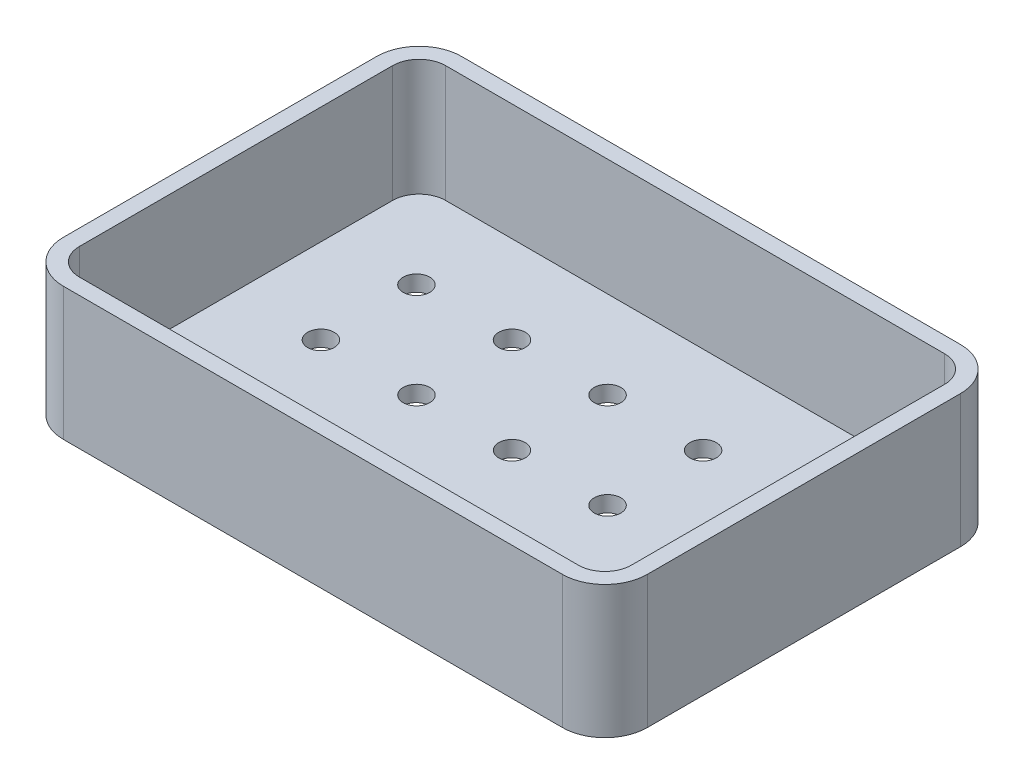
ISO-10303-21;
HEADER;
FILE_DESCRIPTION(('STEP AP214'),'2;1');
FILE_NAME('part.step','',(''),(''),'','','');
FILE_SCHEMA(('AUTOMOTIVE_DESIGN { 1 0 10303 214 1 1 1 1 }'));
ENDSEC;
DATA;
#1=APPLICATION_CONTEXT('core data for automotive mechanical design processes');
#2=APPLICATION_PROTOCOL_DEFINITION('international standard','automotive_design',2000,#1);
#3=PRODUCT_CONTEXT('',#1,'mechanical');
#4=PRODUCT('Part','Part','',(#3));
#5=PRODUCT_RELATED_PRODUCT_CATEGORY('part','',(#4));
#6=PRODUCT_DEFINITION_FORMATION('','',#4);
#7=PRODUCT_DEFINITION_CONTEXT('part definition',#1,'design');
#8=PRODUCT_DEFINITION('design','',#6,#7);
#9=PRODUCT_DEFINITION_SHAPE('','',#8);
#10=(LENGTH_UNIT() NAMED_UNIT(*) SI_UNIT(.MILLI.,.METRE.));
#11=(NAMED_UNIT(*) PLANE_ANGLE_UNIT() SI_UNIT($,.RADIAN.));
#12=(NAMED_UNIT(*) SI_UNIT($,.STERADIAN.) SOLID_ANGLE_UNIT());
#13=UNCERTAINTY_MEASURE_WITH_UNIT(LENGTH_MEASURE(1.E-05),#10,'distance_accuracy_value','');
#14=(GEOMETRIC_REPRESENTATION_CONTEXT(3) GLOBAL_UNCERTAINTY_ASSIGNED_CONTEXT((#13)) GLOBAL_UNIT_ASSIGNED_CONTEXT((#10,
#11,#12)) REPRESENTATION_CONTEXT('',''));
#15=CARTESIAN_POINT('',(0.,0.,0.));
#16=DIRECTION('',(0.,0.,1.));
#17=DIRECTION('',(1.,0.,0.));
#18=AXIS2_PLACEMENT_3D('',#15,#16,#17);
#19=CARTESIAN_POINT('',(-47.,0.,-29.5));
#20=DIRECTION('',(0.,-1.,0.));
#21=DIRECTION('',(0.,0.,-1.));
#22=AXIS2_PLACEMENT_3D('',#19,#20,#21);
#23=PLANE('',#22);
#24=CARTESIAN_POINT('',(-47.,0.,-29.5));
#25=DIRECTION('',(0.,1.,0.));
#26=DIRECTION('',(0.,0.,-1.));
#27=AXIS2_PLACEMENT_3D('',#24,#25,#26);
#28=CIRCLE('',#27,7.99999999999999);
#29=CARTESIAN_POINT('',(-47.,0.,-37.5));
#30=VERTEX_POINT('',#29);
#31=CARTESIAN_POINT('',(-55.,0.,-29.5));
#32=VERTEX_POINT('',#31);
#33=EDGE_CURVE('E165',#30,#32,#28,.T.);
#34=ORIENTED_EDGE('',*,*,#33,.T.);
#35=DIRECTION('',(0.,0.,1.));
#36=VECTOR('',#35,1.);
#37=CARTESIAN_POINT('',(-55.,0.,29.5));
#38=LINE('',#37,#36);
#39=CARTESIAN_POINT('',(-55.,0.,29.5));
#40=VERTEX_POINT('',#39);
#41=EDGE_CURVE('E169',#32,#40,#38,.T.);
#42=ORIENTED_EDGE('',*,*,#41,.T.);
#43=CARTESIAN_POINT('',(-47.,0.,29.5));
#44=DIRECTION('',(0.,1.,0.));
#45=DIRECTION('',(0.,0.,-1.));
#46=AXIS2_PLACEMENT_3D('',#43,#44,#45);
#47=CIRCLE('',#46,7.99999999999999);
#48=CARTESIAN_POINT('',(-47.,0.,37.5));
#49=VERTEX_POINT('',#48);
#50=EDGE_CURVE('E174',#40,#49,#47,.T.);
#51=ORIENTED_EDGE('',*,*,#50,.T.);
#52=DIRECTION('',(1.,0.,0.));
#53=VECTOR('',#52,1.);
#54=CARTESIAN_POINT('',(47.,0.,37.5));
#55=LINE('',#54,#53);
#56=CARTESIAN_POINT('',(47.,0.,37.5));
#57=VERTEX_POINT('',#56);
#58=EDGE_CURVE('E178',#49,#57,#55,.T.);
#59=ORIENTED_EDGE('',*,*,#58,.T.);
#60=CARTESIAN_POINT('',(47.,0.,29.5));
#61=DIRECTION('',(0.,1.,0.));
#62=DIRECTION('',(0.,0.,-1.));
#63=AXIS2_PLACEMENT_3D('',#60,#61,#62);
#64=CIRCLE('',#63,7.99999999999999);
#65=CARTESIAN_POINT('',(55.,0.,29.5));
#66=VERTEX_POINT('',#65);
#67=EDGE_CURVE('E182',#57,#66,#64,.T.);
#68=ORIENTED_EDGE('',*,*,#67,.T.);
#69=DIRECTION('',(0.,0.,-1.));
#70=VECTOR('',#69,1.);
#71=CARTESIAN_POINT('',(55.,0.,-29.5));
#72=LINE('',#71,#70);
#73=CARTESIAN_POINT('',(55.,0.,-29.5));
#74=VERTEX_POINT('',#73);
#75=EDGE_CURVE('E186',#66,#74,#72,.T.);
#76=ORIENTED_EDGE('',*,*,#75,.T.);
#77=CARTESIAN_POINT('',(47.,0.,-29.5));
#78=DIRECTION('',(0.,1.,0.));
#79=DIRECTION('',(0.,0.,-1.));
#80=AXIS2_PLACEMENT_3D('',#77,#78,#79);
#81=CIRCLE('',#80,7.99999999999999);
#82=CARTESIAN_POINT('',(47.,0.,-37.5));
#83=VERTEX_POINT('',#82);
#84=EDGE_CURVE('E135',#74,#83,#81,.T.);
#85=ORIENTED_EDGE('',*,*,#84,.T.);
#86=DIRECTION('',(-1.,0.,0.));
#87=VECTOR('',#86,1.);
#88=CARTESIAN_POINT('',(-47.,0.,-37.5));
#89=LINE('',#88,#87);
#90=EDGE_CURVE('E191',#83,#30,#89,.T.);
#91=ORIENTED_EDGE('',*,*,#90,.T.);
#92=EDGE_LOOP('',(#34,#42,#51,#59,#68,#76,#85,#91));
#93=FACE_BOUND('',#92,.T.);
#94=CARTESIAN_POINT('',(-47.,0.,-29.5));
#95=DIRECTION('',(0.,1.,0.));
#96=DIRECTION('',(0.,0.,-1.));
#97=AXIS2_PLACEMENT_3D('',#94,#95,#96);
#98=CIRCLE('',#97,5.);
#99=CARTESIAN_POINT('',(-47.,0.,-34.5));
#100=VERTEX_POINT('',#99);
#101=CARTESIAN_POINT('',(-52.,0.,-29.5));
#102=VERTEX_POINT('',#101);
#103=EDGE_CURVE('E313',#100,#102,#98,.T.);
#104=ORIENTED_EDGE('',*,*,#103,.F.);
#105=DIRECTION('',(-1.,0.,0.));
#106=VECTOR('',#105,1.);
#107=CARTESIAN_POINT('',(-47.,0.,-34.5));
#108=LINE('',#107,#106);
#109=CARTESIAN_POINT('',(47.,0.,-34.5));
#110=VERTEX_POINT('',#109);
#111=EDGE_CURVE('E290',#110,#100,#108,.T.);
#112=ORIENTED_EDGE('',*,*,#111,.F.);
#113=CARTESIAN_POINT('',(47.,0.,-29.5));
#114=DIRECTION('',(0.,1.,0.));
#115=DIRECTION('',(0.,0.,-1.));
#116=AXIS2_PLACEMENT_3D('',#113,#114,#115);
#117=CIRCLE('',#116,5.);
#118=CARTESIAN_POINT('',(52.,0.,-29.5));
#119=VERTEX_POINT('',#118);
#120=EDGE_CURVE('E572',#119,#110,#117,.T.);
#121=ORIENTED_EDGE('',*,*,#120,.F.);
#122=DIRECTION('',(0.,0.,-1.));
#123=VECTOR('',#122,1.);
#124=CARTESIAN_POINT('',(52.,0.,-29.5));
#125=LINE('',#124,#123);
#126=CARTESIAN_POINT('',(52.,0.,29.5));
#127=VERTEX_POINT('',#126);
#128=EDGE_CURVE('E570',#127,#119,#125,.T.);
#129=ORIENTED_EDGE('',*,*,#128,.F.);
#130=CARTESIAN_POINT('',(47.,0.,29.5));
#131=DIRECTION('',(0.,1.,0.));
#132=DIRECTION('',(0.,0.,-1.));
#133=AXIS2_PLACEMENT_3D('',#130,#131,#132);
#134=CIRCLE('',#133,5.);
#135=CARTESIAN_POINT('',(47.,0.,34.5));
#136=VERTEX_POINT('',#135);
#137=EDGE_CURVE('E566',#136,#127,#134,.T.);
#138=ORIENTED_EDGE('',*,*,#137,.F.);
#139=DIRECTION('',(1.,0.,0.));
#140=VECTOR('',#139,1.);
#141=CARTESIAN_POINT('',(47.,0.,34.5));
#142=LINE('',#141,#140);
#143=CARTESIAN_POINT('',(-47.,0.,34.5));
#144=VERTEX_POINT('',#143);
#145=EDGE_CURVE('E562',#144,#136,#142,.T.);
#146=ORIENTED_EDGE('',*,*,#145,.F.);
#147=CARTESIAN_POINT('',(-47.,0.,29.5));
#148=DIRECTION('',(0.,1.,0.));
#149=DIRECTION('',(0.,0.,-1.));
#150=AXIS2_PLACEMENT_3D('',#147,#148,#149);
#151=CIRCLE('',#150,5.);
#152=CARTESIAN_POINT('',(-52.,0.,29.5));
#153=VERTEX_POINT('',#152);
#154=EDGE_CURVE('E558',#153,#144,#151,.T.);
#155=ORIENTED_EDGE('',*,*,#154,.F.);
#156=DIRECTION('',(0.,0.,1.));
#157=VECTOR('',#156,1.);
#158=CARTESIAN_POINT('',(-52.,0.,29.5));
#159=LINE('',#158,#157);
#160=EDGE_CURVE('E554',#102,#153,#159,.T.);
#161=ORIENTED_EDGE('',*,*,#160,.F.);
#162=EDGE_LOOP('',(#104,#112,#121,#129,#138,#146,#155,#161));
#163=FACE_BOUND('',#162,.T.);
#164=ADVANCED_FACE('F45',(#93,#163),#23,.F.);
#165=CARTESIAN_POINT('',(-47.,-25.,-29.5));
#166=DIRECTION('',(0.,1.,0.));
#167=DIRECTION('',(0.,0.,1.));
#168=AXIS2_PLACEMENT_3D('',#165,#166,#167);
#169=CYLINDRICAL_SURFACE('',#168,7.99999999999999);
#170=ORIENTED_EDGE('',*,*,#33,.F.);
#171=DIRECTION('',(0.,1.,0.));
#172=VECTOR('',#171,1.);
#173=CARTESIAN_POINT('',(-47.,-25.,-37.5));
#174=LINE('',#173,#172);
#175=CARTESIAN_POINT('',(-47.,-25.,-37.5));
#176=VERTEX_POINT('',#175);
#177=EDGE_CURVE('E11',#176,#30,#174,.T.);
#178=ORIENTED_EDGE('',*,*,#177,.F.);
#179=CARTESIAN_POINT('',(-47.,-25.,-29.5));
#180=DIRECTION('',(0.,1.,0.));
#181=DIRECTION('',(0.,0.,-1.));
#182=AXIS2_PLACEMENT_3D('',#179,#180,#181);
#183=CIRCLE('',#182,7.99999999999999);
#184=CARTESIAN_POINT('',(-55.,-25.,-29.5));
#185=VERTEX_POINT('',#184);
#186=EDGE_CURVE('E194',#176,#185,#183,.T.);
#187=ORIENTED_EDGE('',*,*,#186,.T.);
#188=DIRECTION('',(0.,1.,0.));
#189=VECTOR('',#188,1.);
#190=CARTESIAN_POINT('',(-55.,-25.,-29.5));
#191=LINE('',#190,#189);
#192=EDGE_CURVE('E109',#185,#32,#191,.T.);
#193=ORIENTED_EDGE('',*,*,#192,.T.);
#194=EDGE_LOOP('',(#170,#178,#187,#193));
#195=FACE_BOUND('',#194,.T.);
#196=ADVANCED_FACE('F47',(#195),#169,.T.);
#197=CARTESIAN_POINT('',(-47.,-25.,-37.5));
#198=DIRECTION('',(0.,0.,-1.));
#199=DIRECTION('',(-1.,0.,0.));
#200=AXIS2_PLACEMENT_3D('',#197,#198,#199);
#201=PLANE('',#200);
#202=ORIENTED_EDGE('',*,*,#90,.F.);
#203=DIRECTION('',(0.,1.,0.));
#204=VECTOR('',#203,1.);
#205=CARTESIAN_POINT('',(47.,-25.,-37.5));
#206=LINE('',#205,#204);
#207=CARTESIAN_POINT('',(47.,-25.,-37.5));
#208=VERTEX_POINT('',#207);
#209=EDGE_CURVE('E55',#208,#83,#206,.T.);
#210=ORIENTED_EDGE('',*,*,#209,.F.);
#211=DIRECTION('',(-1.,0.,0.));
#212=VECTOR('',#211,1.);
#213=CARTESIAN_POINT('',(-47.,-25.,-37.5));
#214=LINE('',#213,#212);
#215=EDGE_CURVE('E149',#208,#176,#214,.T.);
#216=ORIENTED_EDGE('',*,*,#215,.T.);
#217=ORIENTED_EDGE('',*,*,#177,.T.);
#218=EDGE_LOOP('',(#202,#210,#216,#217));
#219=FACE_BOUND('',#218,.T.);
#220=ADVANCED_FACE('F365',(#219),#201,.T.);
#221=CARTESIAN_POINT('',(47.,-25.,-29.5));
#222=DIRECTION('',(0.,1.,0.));
#223=DIRECTION('',(0.,0.,1.));
#224=AXIS2_PLACEMENT_3D('',#221,#222,#223);
#225=CYLINDRICAL_SURFACE('',#224,7.99999999999999);
#226=ORIENTED_EDGE('',*,*,#84,.F.);
#227=DIRECTION('',(0.,1.,0.));
#228=VECTOR('',#227,1.);
#229=CARTESIAN_POINT('',(55.,-25.,-29.5));
#230=LINE('',#229,#228);
#231=CARTESIAN_POINT('',(55.,-25.,-29.5));
#232=VERTEX_POINT('',#231);
#233=EDGE_CURVE('E129',#232,#74,#230,.T.);
#234=ORIENTED_EDGE('',*,*,#233,.F.);
#235=CARTESIAN_POINT('',(47.,-25.,-29.5));
#236=DIRECTION('',(0.,1.,0.));
#237=DIRECTION('',(0.,0.,-1.));
#238=AXIS2_PLACEMENT_3D('',#235,#236,#237);
#239=CIRCLE('',#238,7.99999999999999);
#240=EDGE_CURVE('E132',#232,#208,#239,.T.);
#241=ORIENTED_EDGE('',*,*,#240,.T.);
#242=ORIENTED_EDGE('',*,*,#209,.T.);
#243=EDGE_LOOP('',(#226,#234,#241,#242));
#244=FACE_BOUND('',#243,.T.);
#245=ADVANCED_FACE('F131',(#244),#225,.T.);
#246=CARTESIAN_POINT('',(55.,-25.,-29.5));
#247=DIRECTION('',(1.,0.,0.));
#248=DIRECTION('',(0.,0.,-1.));
#249=AXIS2_PLACEMENT_3D('',#246,#247,#248);
#250=PLANE('',#249);
#251=ORIENTED_EDGE('',*,*,#75,.F.);
#252=DIRECTION('',(0.,1.,0.));
#253=VECTOR('',#252,1.);
#254=CARTESIAN_POINT('',(55.,-25.,29.5));
#255=LINE('',#254,#253);
#256=CARTESIAN_POINT('',(55.,-25.,29.5));
#257=VERTEX_POINT('',#256);
#258=EDGE_CURVE('E141',#257,#66,#255,.T.);
#259=ORIENTED_EDGE('',*,*,#258,.F.);
#260=DIRECTION('',(0.,0.,-1.));
#261=VECTOR('',#260,1.);
#262=CARTESIAN_POINT('',(55.,-25.,-29.5));
#263=LINE('',#262,#261);
#264=EDGE_CURVE('E147',#257,#232,#263,.T.);
#265=ORIENTED_EDGE('',*,*,#264,.T.);
#266=ORIENTED_EDGE('',*,*,#233,.T.);
#267=EDGE_LOOP('',(#251,#259,#265,#266));
#268=FACE_BOUND('',#267,.T.);
#269=ADVANCED_FACE('F152',(#268),#250,.T.);
#270=CARTESIAN_POINT('',(47.,-25.,29.5));
#271=DIRECTION('',(0.,1.,0.));
#272=DIRECTION('',(0.,0.,1.));
#273=AXIS2_PLACEMENT_3D('',#270,#271,#272);
#274=CYLINDRICAL_SURFACE('',#273,7.99999999999999);
#275=ORIENTED_EDGE('',*,*,#67,.F.);
#276=DIRECTION('',(0.,1.,0.));
#277=VECTOR('',#276,1.);
#278=CARTESIAN_POINT('',(47.,-25.,37.5));
#279=LINE('',#278,#277);
#280=CARTESIAN_POINT('',(47.,-25.,37.5));
#281=VERTEX_POINT('',#280);
#282=EDGE_CURVE('E200',#281,#57,#279,.T.);
#283=ORIENTED_EDGE('',*,*,#282,.F.);
#284=CARTESIAN_POINT('',(47.,-25.,29.5));
#285=DIRECTION('',(0.,1.,0.));
#286=DIRECTION('',(0.,0.,-1.));
#287=AXIS2_PLACEMENT_3D('',#284,#285,#286);
#288=CIRCLE('',#287,7.99999999999999);
#289=EDGE_CURVE('E154',#281,#257,#288,.T.);
#290=ORIENTED_EDGE('',*,*,#289,.T.);
#291=ORIENTED_EDGE('',*,*,#258,.T.);
#292=EDGE_LOOP('',(#275,#283,#290,#291));
#293=FACE_BOUND('',#292,.T.);
#294=ADVANCED_FACE('F872',(#293),#274,.T.);
#295=CARTESIAN_POINT('',(47.,-25.,37.5));
#296=DIRECTION('',(0.,0.,1.));
#297=DIRECTION('',(1.,0.,0.));
#298=AXIS2_PLACEMENT_3D('',#295,#296,#297);
#299=PLANE('',#298);
#300=ORIENTED_EDGE('',*,*,#58,.F.);
#301=DIRECTION('',(0.,1.,0.));
#302=VECTOR('',#301,1.);
#303=CARTESIAN_POINT('',(-47.,-25.,37.5));
#304=LINE('',#303,#302);
#305=CARTESIAN_POINT('',(-47.,-25.,37.5));
#306=VERTEX_POINT('',#305);
#307=EDGE_CURVE('E203',#306,#49,#304,.T.);
#308=ORIENTED_EDGE('',*,*,#307,.F.);
#309=DIRECTION('',(1.,0.,0.));
#310=VECTOR('',#309,1.);
#311=CARTESIAN_POINT('',(47.,-25.,37.5));
#312=LINE('',#311,#310);
#313=EDGE_CURVE('E159',#306,#281,#312,.T.);
#314=ORIENTED_EDGE('',*,*,#313,.T.);
#315=ORIENTED_EDGE('',*,*,#282,.T.);
#316=EDGE_LOOP('',(#300,#308,#314,#315));
#317=FACE_BOUND('',#316,.T.);
#318=ADVANCED_FACE('F356',(#317),#299,.T.);
#319=CARTESIAN_POINT('',(-47.,-25.,29.5));
#320=DIRECTION('',(0.,1.,0.));
#321=DIRECTION('',(0.,0.,1.));
#322=AXIS2_PLACEMENT_3D('',#319,#320,#321);
#323=CYLINDRICAL_SURFACE('',#322,7.99999999999999);
#324=ORIENTED_EDGE('',*,*,#50,.F.);
#325=DIRECTION('',(0.,1.,0.));
#326=VECTOR('',#325,1.);
#327=CARTESIAN_POINT('',(-55.,-25.,29.5));
#328=LINE('',#327,#326);
#329=CARTESIAN_POINT('',(-55.,-25.,29.5));
#330=VERTEX_POINT('',#329);
#331=EDGE_CURVE('E206',#330,#40,#328,.T.);
#332=ORIENTED_EDGE('',*,*,#331,.F.);
#333=CARTESIAN_POINT('',(-47.,-25.,29.5));
#334=DIRECTION('',(0.,1.,0.));
#335=DIRECTION('',(0.,0.,-1.));
#336=AXIS2_PLACEMENT_3D('',#333,#334,#335);
#337=CIRCLE('',#336,7.99999999999999);
#338=EDGE_CURVE('E347',#330,#306,#337,.T.);
#339=ORIENTED_EDGE('',*,*,#338,.T.);
#340=ORIENTED_EDGE('',*,*,#307,.T.);
#341=EDGE_LOOP('',(#324,#332,#339,#340));
#342=FACE_BOUND('',#341,.T.);
#343=ADVANCED_FACE('F361',(#342),#323,.T.);
#344=CARTESIAN_POINT('',(-55.,-25.,29.5));
#345=DIRECTION('',(-1.,0.,0.));
#346=DIRECTION('',(0.,0.,1.));
#347=AXIS2_PLACEMENT_3D('',#344,#345,#346);
#348=PLANE('',#347);
#349=ORIENTED_EDGE('',*,*,#41,.F.);
#350=ORIENTED_EDGE('',*,*,#192,.F.);
#351=DIRECTION('',(0.,0.,1.));
#352=VECTOR('',#351,1.);
#353=CARTESIAN_POINT('',(-55.,-25.,29.5));
#354=LINE('',#353,#352);
#355=EDGE_CURVE('E344',#185,#330,#354,.T.);
#356=ORIENTED_EDGE('',*,*,#355,.T.);
#357=ORIENTED_EDGE('',*,*,#331,.T.);
#358=EDGE_LOOP('',(#349,#350,#356,#357));
#359=FACE_BOUND('',#358,.T.);
#360=ADVANCED_FACE('F362',(#359),#348,.T.);
#361=CARTESIAN_POINT('',(-47.,-25.,-29.5));
#362=DIRECTION('',(0.,-1.,0.));
#363=DIRECTION('',(0.,0.,-1.));
#364=AXIS2_PLACEMENT_3D('',#361,#362,#363);
#365=PLANE('',#364);
#366=CARTESIAN_POINT('',(-18.,-25.,-18.));
#367=DIRECTION('',(0.,1.,0.));
#368=DIRECTION('',(0.,0.,1.));
#369=AXIS2_PLACEMENT_3D('',#366,#367,#368);
#370=CIRCLE('',#369,2.5);
#371=CARTESIAN_POINT('',(-18.,-25.,-15.5));
#372=VERTEX_POINT('',#371);
#373=EDGE_CURVE('E520',#372,#372,#370,.T.);
#374=ORIENTED_EDGE('',*,*,#373,.T.);
#375=EDGE_LOOP('',(#374));
#376=FACE_BOUND('',#375,.T.);
#377=CARTESIAN_POINT('',(0.,-25.,-18.));
#378=DIRECTION('',(0.,1.,0.));
#379=DIRECTION('',(0.,0.,1.));
#380=AXIS2_PLACEMENT_3D('',#377,#378,#379);
#381=CIRCLE('',#380,2.5);
#382=CARTESIAN_POINT('',(0.,-25.,-15.5));
#383=VERTEX_POINT('',#382);
#384=EDGE_CURVE('E524',#383,#383,#381,.T.);
#385=ORIENTED_EDGE('',*,*,#384,.T.);
#386=EDGE_LOOP('',(#385));
#387=FACE_BOUND('',#386,.T.);
#388=CARTESIAN_POINT('',(18.,-25.,-18.));
#389=DIRECTION('',(0.,1.,0.));
#390=DIRECTION('',(0.,0.,1.));
#391=AXIS2_PLACEMENT_3D('',#388,#389,#390);
#392=CIRCLE('',#391,2.5);
#393=CARTESIAN_POINT('',(18.,-25.,-15.5));
#394=VERTEX_POINT('',#393);
#395=EDGE_CURVE('E528',#394,#394,#392,.T.);
#396=ORIENTED_EDGE('',*,*,#395,.T.);
#397=EDGE_LOOP('',(#396));
#398=FACE_BOUND('',#397,.T.);
#399=CARTESIAN_POINT('',(36.,-25.,-18.));
#400=DIRECTION('',(0.,1.,0.));
#401=DIRECTION('',(0.,0.,1.));
#402=AXIS2_PLACEMENT_3D('',#399,#400,#401);
#403=CIRCLE('',#402,2.5);
#404=CARTESIAN_POINT('',(36.,-25.,-15.5));
#405=VERTEX_POINT('',#404);
#406=EDGE_CURVE('E532',#405,#405,#403,.T.);
#407=ORIENTED_EDGE('',*,*,#406,.T.);
#408=EDGE_LOOP('',(#407));
#409=FACE_BOUND('',#408,.T.);
#410=CARTESIAN_POINT('',(-36.,-25.,0.));
#411=DIRECTION('',(0.,1.,0.));
#412=DIRECTION('',(0.,0.,1.));
#413=AXIS2_PLACEMENT_3D('',#410,#411,#412);
#414=CIRCLE('',#413,2.5);
#415=CARTESIAN_POINT('',(-36.,-25.,2.5));
#416=VERTEX_POINT('',#415);
#417=EDGE_CURVE('E536',#416,#416,#414,.T.);
#418=ORIENTED_EDGE('',*,*,#417,.T.);
#419=EDGE_LOOP('',(#418));
#420=FACE_BOUND('',#419,.T.);
#421=CARTESIAN_POINT('',(-18.,-25.,0.));
#422=DIRECTION('',(0.,1.,0.));
#423=DIRECTION('',(0.,0.,1.));
#424=AXIS2_PLACEMENT_3D('',#421,#422,#423);
#425=CIRCLE('',#424,2.5);
#426=CARTESIAN_POINT('',(-18.,-25.,2.5));
#427=VERTEX_POINT('',#426);
#428=EDGE_CURVE('E539',#427,#427,#425,.T.);
#429=ORIENTED_EDGE('',*,*,#428,.T.);
#430=EDGE_LOOP('',(#429));
#431=FACE_BOUND('',#430,.T.);
#432=CARTESIAN_POINT('',(0.,-25.,0.));
#433=DIRECTION('',(0.,1.,0.));
#434=DIRECTION('',(0.,0.,1.));
#435=AXIS2_PLACEMENT_3D('',#432,#433,#434);
#436=CIRCLE('',#435,2.5);
#437=CARTESIAN_POINT('',(0.,-25.,2.5));
#438=VERTEX_POINT('',#437);
#439=EDGE_CURVE('E542',#438,#438,#436,.T.);
#440=ORIENTED_EDGE('',*,*,#439,.T.);
#441=EDGE_LOOP('',(#440));
#442=FACE_BOUND('',#441,.T.);
#443=CARTESIAN_POINT('',(18.,-25.,0.));
#444=DIRECTION('',(0.,1.,0.));
#445=DIRECTION('',(0.,0.,1.));
#446=AXIS2_PLACEMENT_3D('',#443,#444,#445);
#447=CIRCLE('',#446,2.5);
#448=CARTESIAN_POINT('',(18.,-25.,2.5));
#449=VERTEX_POINT('',#448);
#450=EDGE_CURVE('E516',#449,#449,#447,.T.);
#451=ORIENTED_EDGE('',*,*,#450,.T.);
#452=EDGE_LOOP('',(#451));
#453=FACE_BOUND('',#452,.T.);
#454=CARTESIAN_POINT('',(36.,-25.,18.));
#455=DIRECTION('',(0.,1.,0.));
#456=DIRECTION('',(0.,0.,1.));
#457=AXIS2_PLACEMENT_3D('',#454,#455,#456);
#458=CIRCLE('',#457,2.5);
#459=CARTESIAN_POINT('',(36.,-25.,20.5));
#460=VERTEX_POINT('',#459);
#461=EDGE_CURVE('E497',#460,#460,#458,.T.);
#462=ORIENTED_EDGE('',*,*,#461,.T.);
#463=EDGE_LOOP('',(#462));
#464=FACE_BOUND('',#463,.T.);
#465=CARTESIAN_POINT('',(18.,-25.,18.));
#466=DIRECTION('',(0.,1.,0.));
#467=DIRECTION('',(0.,0.,1.));
#468=AXIS2_PLACEMENT_3D('',#465,#466,#467);
#469=CIRCLE('',#468,2.5);
#470=CARTESIAN_POINT('',(18.,-25.,20.5));
#471=VERTEX_POINT('',#470);
#472=EDGE_CURVE('E477',#471,#471,#469,.T.);
#473=ORIENTED_EDGE('',*,*,#472,.T.);
#474=EDGE_LOOP('',(#473));
#475=FACE_BOUND('',#474,.T.);
#476=CARTESIAN_POINT('',(36.,-25.,0.));
#477=DIRECTION('',(0.,1.,0.));
#478=DIRECTION('',(0.,0.,1.));
#479=AXIS2_PLACEMENT_3D('',#476,#477,#478);
#480=CIRCLE('',#479,2.5);
#481=CARTESIAN_POINT('',(36.,-25.,2.5));
#482=VERTEX_POINT('',#481);
#483=EDGE_CURVE('E512',#482,#482,#480,.T.);
#484=ORIENTED_EDGE('',*,*,#483,.T.);
#485=EDGE_LOOP('',(#484));
#486=FACE_BOUND('',#485,.T.);
#487=CARTESIAN_POINT('',(-36.,-25.,18.));
#488=DIRECTION('',(0.,1.,0.));
#489=DIRECTION('',(0.,0.,1.));
#490=AXIS2_PLACEMENT_3D('',#487,#488,#489);
#491=CIRCLE('',#490,2.5);
#492=CARTESIAN_POINT('',(-36.,-25.,20.5));
#493=VERTEX_POINT('',#492);
#494=EDGE_CURVE('E510',#493,#493,#491,.T.);
#495=ORIENTED_EDGE('',*,*,#494,.T.);
#496=EDGE_LOOP('',(#495));
#497=FACE_BOUND('',#496,.T.);
#498=CARTESIAN_POINT('',(-18.,-25.,18.));
#499=DIRECTION('',(0.,1.,0.));
#500=DIRECTION('',(0.,0.,1.));
#501=AXIS2_PLACEMENT_3D('',#498,#499,#500);
#502=CIRCLE('',#501,2.5);
#503=CARTESIAN_POINT('',(-18.,-25.,20.5));
#504=VERTEX_POINT('',#503);
#505=EDGE_CURVE('E502',#504,#504,#502,.T.);
#506=ORIENTED_EDGE('',*,*,#505,.T.);
#507=EDGE_LOOP('',(#506));
#508=FACE_BOUND('',#507,.T.);
#509=CARTESIAN_POINT('',(0.,-25.,18.));
#510=DIRECTION('',(0.,1.,0.));
#511=DIRECTION('',(0.,0.,1.));
#512=AXIS2_PLACEMENT_3D('',#509,#510,#511);
#513=CIRCLE('',#512,2.5);
#514=CARTESIAN_POINT('',(0.,-25.,20.5));
#515=VERTEX_POINT('',#514);
#516=EDGE_CURVE('E496',#515,#515,#513,.T.);
#517=ORIENTED_EDGE('',*,*,#516,.T.);
#518=EDGE_LOOP('',(#517));
#519=FACE_BOUND('',#518,.T.);
#520=CARTESIAN_POINT('',(-36.,-25.,-18.));
#521=DIRECTION('',(0.,1.,0.));
#522=DIRECTION('',(0.,0.,1.));
#523=AXIS2_PLACEMENT_3D('',#520,#521,#522);
#524=CIRCLE('',#523,2.5);
#525=CARTESIAN_POINT('',(-36.,-25.,-15.5));
#526=VERTEX_POINT('',#525);
#527=EDGE_CURVE('E216',#526,#526,#524,.T.);
#528=ORIENTED_EDGE('',*,*,#527,.T.);
#529=EDGE_LOOP('',(#528));
#530=FACE_BOUND('',#529,.T.);
#531=ORIENTED_EDGE('',*,*,#186,.F.);
#532=ORIENTED_EDGE('',*,*,#215,.F.);
#533=ORIENTED_EDGE('',*,*,#240,.F.);
#534=ORIENTED_EDGE('',*,*,#264,.F.);
#535=ORIENTED_EDGE('',*,*,#289,.F.);
#536=ORIENTED_EDGE('',*,*,#313,.F.);
#537=ORIENTED_EDGE('',*,*,#338,.F.);
#538=ORIENTED_EDGE('',*,*,#355,.F.);
#539=EDGE_LOOP('',(#531,#532,#533,#534,#535,#536,#537,#538));
#540=FACE_BOUND('',#539,.T.);
#541=ADVANCED_FACE('F145',(#376,#387,#398,#409,#420,#431,#442,#453,#464,#475,#486,#497,#508,
#519,#530,#540),#365,.T.);
#542=CARTESIAN_POINT('',(-47.,0.,-29.5));
#543=DIRECTION('',(0.,-1.,0.));
#544=DIRECTION('',(0.,0.,-1.));
#545=AXIS2_PLACEMENT_3D('',#542,#543,#544);
#546=CYLINDRICAL_SURFACE('',#545,5.);
#547=CARTESIAN_POINT('',(-47.,-22.,-29.5));
#548=DIRECTION('',(0.,1.,0.));
#549=DIRECTION('',(0.,0.,-1.));
#550=AXIS2_PLACEMENT_3D('',#547,#548,#549);
#551=CIRCLE('',#550,5.);
#552=CARTESIAN_POINT('',(-47.,-22.,-34.5));
#553=VERTEX_POINT('',#552);
#554=CARTESIAN_POINT('',(-52.,-22.,-29.5));
#555=VERTEX_POINT('',#554);
#556=EDGE_CURVE('E271',#553,#555,#551,.T.);
#557=ORIENTED_EDGE('',*,*,#556,.F.);
#558=DIRECTION('',(0.,-1.,0.));
#559=VECTOR('',#558,1.);
#560=CARTESIAN_POINT('',(-47.,0.,-34.5));
#561=LINE('',#560,#559);
#562=EDGE_CURVE('E314',#100,#553,#561,.T.);
#563=ORIENTED_EDGE('',*,*,#562,.F.);
#564=ORIENTED_EDGE('',*,*,#103,.T.);
#565=DIRECTION('',(0.,-1.,0.));
#566=VECTOR('',#565,1.);
#567=CARTESIAN_POINT('',(-52.,0.,-29.5));
#568=LINE('',#567,#566);
#569=EDGE_CURVE('E170',#102,#555,#568,.T.);
#570=ORIENTED_EDGE('',*,*,#569,.T.);
#571=EDGE_LOOP('',(#557,#563,#564,#570));
#572=FACE_BOUND('',#571,.T.);
#573=ADVANCED_FACE('F378',(#572),#546,.F.);
#574=CARTESIAN_POINT('',(-52.,0.,29.5));
#575=DIRECTION('',(1.,0.,0.));
#576=DIRECTION('',(0.,0.,-1.));
#577=AXIS2_PLACEMENT_3D('',#574,#575,#576);
#578=PLANE('',#577);
#579=DIRECTION('',(0.,0.,1.));
#580=VECTOR('',#579,1.);
#581=CARTESIAN_POINT('',(-52.,-22.,29.5));
#582=LINE('',#581,#580);
#583=CARTESIAN_POINT('',(-52.,-22.,29.5));
#584=VERTEX_POINT('',#583);
#585=EDGE_CURVE('E277',#555,#584,#582,.T.);
#586=ORIENTED_EDGE('',*,*,#585,.F.);
#587=ORIENTED_EDGE('',*,*,#569,.F.);
#588=ORIENTED_EDGE('',*,*,#160,.T.);
#589=DIRECTION('',(0.,-1.,0.));
#590=VECTOR('',#589,1.);
#591=CARTESIAN_POINT('',(-52.,0.,29.5));
#592=LINE('',#591,#590);
#593=EDGE_CURVE('E335',#153,#584,#592,.T.);
#594=ORIENTED_EDGE('',*,*,#593,.T.);
#595=EDGE_LOOP('',(#586,#587,#588,#594));
#596=FACE_BOUND('',#595,.T.);
#597=ADVANCED_FACE('F382',(#596),#578,.T.);
#598=CARTESIAN_POINT('',(-47.,0.,29.5));
#599=DIRECTION('',(0.,-1.,0.));
#600=DIRECTION('',(0.,0.,-1.));
#601=AXIS2_PLACEMENT_3D('',#598,#599,#600);
#602=CYLINDRICAL_SURFACE('',#601,5.);
#603=CARTESIAN_POINT('',(-47.,-22.,29.5));
#604=DIRECTION('',(0.,1.,0.));
#605=DIRECTION('',(0.,0.,-1.));
#606=AXIS2_PLACEMENT_3D('',#603,#604,#605);
#607=CIRCLE('',#606,5.);
#608=CARTESIAN_POINT('',(-47.,-22.,34.5));
#609=VERTEX_POINT('',#608);
#610=EDGE_CURVE('E287',#584,#609,#607,.T.);
#611=ORIENTED_EDGE('',*,*,#610,.F.);
#612=ORIENTED_EDGE('',*,*,#593,.F.);
#613=ORIENTED_EDGE('',*,*,#154,.T.);
#614=DIRECTION('',(0.,-1.,0.));
#615=VECTOR('',#614,1.);
#616=CARTESIAN_POINT('',(-47.,0.,34.5));
#617=LINE('',#616,#615);
#618=EDGE_CURVE('E331',#144,#609,#617,.T.);
#619=ORIENTED_EDGE('',*,*,#618,.T.);
#620=EDGE_LOOP('',(#611,#612,#613,#619));
#621=FACE_BOUND('',#620,.T.);
#622=ADVANCED_FACE('F386',(#621),#602,.F.);
#623=CARTESIAN_POINT('',(47.,0.,34.5));
#624=DIRECTION('',(0.,0.,-1.));
#625=DIRECTION('',(-1.,0.,0.));
#626=AXIS2_PLACEMENT_3D('',#623,#624,#625);
#627=PLANE('',#626);
#628=DIRECTION('',(1.,0.,0.));
#629=VECTOR('',#628,1.);
#630=CARTESIAN_POINT('',(47.,-22.,34.5));
#631=LINE('',#630,#629);
#632=CARTESIAN_POINT('',(47.,-22.,34.5));
#633=VERTEX_POINT('',#632);
#634=EDGE_CURVE('E295',#609,#633,#631,.T.);
#635=ORIENTED_EDGE('',*,*,#634,.F.);
#636=ORIENTED_EDGE('',*,*,#618,.F.);
#637=ORIENTED_EDGE('',*,*,#145,.T.);
#638=DIRECTION('',(0.,-1.,0.));
#639=VECTOR('',#638,1.);
#640=CARTESIAN_POINT('',(47.,0.,34.5));
#641=LINE('',#640,#639);
#642=EDGE_CURVE('E327',#136,#633,#641,.T.);
#643=ORIENTED_EDGE('',*,*,#642,.T.);
#644=EDGE_LOOP('',(#635,#636,#637,#643));
#645=FACE_BOUND('',#644,.T.);
#646=ADVANCED_FACE('F390',(#645),#627,.T.);
#647=CARTESIAN_POINT('',(47.,0.,29.5));
#648=DIRECTION('',(0.,-1.,0.));
#649=DIRECTION('',(0.,0.,-1.));
#650=AXIS2_PLACEMENT_3D('',#647,#648,#649);
#651=CYLINDRICAL_SURFACE('',#650,5.);
#652=CARTESIAN_POINT('',(47.,-22.,29.5));
#653=DIRECTION('',(0.,1.,0.));
#654=DIRECTION('',(0.,0.,-1.));
#655=AXIS2_PLACEMENT_3D('',#652,#653,#654);
#656=CIRCLE('',#655,5.);
#657=CARTESIAN_POINT('',(52.,-22.,29.5));
#658=VERTEX_POINT('',#657);
#659=EDGE_CURVE('E299',#633,#658,#656,.T.);
#660=ORIENTED_EDGE('',*,*,#659,.F.);
#661=ORIENTED_EDGE('',*,*,#642,.F.);
#662=ORIENTED_EDGE('',*,*,#137,.T.);
#663=DIRECTION('',(0.,-1.,0.));
#664=VECTOR('',#663,1.);
#665=CARTESIAN_POINT('',(52.,0.,29.5));
#666=LINE('',#665,#664);
#667=EDGE_CURVE('E324',#127,#658,#666,.T.);
#668=ORIENTED_EDGE('',*,*,#667,.T.);
#669=EDGE_LOOP('',(#660,#661,#662,#668));
#670=FACE_BOUND('',#669,.T.);
#671=ADVANCED_FACE('F394',(#670),#651,.F.);
#672=CARTESIAN_POINT('',(52.,0.,-29.5));
#673=DIRECTION('',(-1.,0.,0.));
#674=DIRECTION('',(0.,0.,1.));
#675=AXIS2_PLACEMENT_3D('',#672,#673,#674);
#676=PLANE('',#675);
#677=DIRECTION('',(0.,0.,-1.));
#678=VECTOR('',#677,1.);
#679=CARTESIAN_POINT('',(52.,-22.,-29.5));
#680=LINE('',#679,#678);
#681=CARTESIAN_POINT('',(52.,-22.,-29.5));
#682=VERTEX_POINT('',#681);
#683=EDGE_CURVE('E303',#658,#682,#680,.T.);
#684=ORIENTED_EDGE('',*,*,#683,.F.);
#685=ORIENTED_EDGE('',*,*,#667,.F.);
#686=ORIENTED_EDGE('',*,*,#128,.T.);
#687=DIRECTION('',(0.,-1.,0.));
#688=VECTOR('',#687,1.);
#689=CARTESIAN_POINT('',(52.,0.,-29.5));
#690=LINE('',#689,#688);
#691=EDGE_CURVE('E320',#119,#682,#690,.T.);
#692=ORIENTED_EDGE('',*,*,#691,.T.);
#693=EDGE_LOOP('',(#684,#685,#686,#692));
#694=FACE_BOUND('',#693,.T.);
#695=ADVANCED_FACE('F398',(#694),#676,.T.);
#696=CARTESIAN_POINT('',(47.,0.,-29.5));
#697=DIRECTION('',(0.,-1.,0.));
#698=DIRECTION('',(0.,0.,-1.));
#699=AXIS2_PLACEMENT_3D('',#696,#697,#698);
#700=CYLINDRICAL_SURFACE('',#699,5.);
#701=CARTESIAN_POINT('',(47.,-22.,-29.5));
#702=DIRECTION('',(0.,1.,0.));
#703=DIRECTION('',(0.,0.,-1.));
#704=AXIS2_PLACEMENT_3D('',#701,#702,#703);
#705=CIRCLE('',#704,5.);
#706=CARTESIAN_POINT('',(47.,-22.,-34.5));
#707=VERTEX_POINT('',#706);
#708=EDGE_CURVE('E307',#682,#707,#705,.T.);
#709=ORIENTED_EDGE('',*,*,#708,.F.);
#710=ORIENTED_EDGE('',*,*,#691,.F.);
#711=ORIENTED_EDGE('',*,*,#120,.T.);
#712=DIRECTION('',(0.,-1.,0.));
#713=VECTOR('',#712,1.);
#714=CARTESIAN_POINT('',(47.,0.,-34.5));
#715=LINE('',#714,#713);
#716=EDGE_CURVE('E63',#110,#707,#715,.T.);
#717=ORIENTED_EDGE('',*,*,#716,.T.);
#718=EDGE_LOOP('',(#709,#710,#711,#717));
#719=FACE_BOUND('',#718,.T.);
#720=ADVANCED_FACE('F402',(#719),#700,.F.);
#721=CARTESIAN_POINT('',(-47.,0.,-34.5));
#722=DIRECTION('',(0.,0.,1.));
#723=DIRECTION('',(1.,0.,0.));
#724=AXIS2_PLACEMENT_3D('',#721,#722,#723);
#725=PLANE('',#724);
#726=DIRECTION('',(-1.,0.,0.));
#727=VECTOR('',#726,1.);
#728=CARTESIAN_POINT('',(-47.,-22.,-34.5));
#729=LINE('',#728,#727);
#730=EDGE_CURVE('E311',#707,#553,#729,.T.);
#731=ORIENTED_EDGE('',*,*,#730,.F.);
#732=ORIENTED_EDGE('',*,*,#716,.F.);
#733=ORIENTED_EDGE('',*,*,#111,.T.);
#734=ORIENTED_EDGE('',*,*,#562,.T.);
#735=EDGE_LOOP('',(#731,#732,#733,#734));
#736=FACE_BOUND('',#735,.T.);
#737=ADVANCED_FACE('F406',(#736),#725,.T.);
#738=CARTESIAN_POINT('',(-47.,-22.,-29.5));
#739=DIRECTION('',(0.,-1.,0.));
#740=DIRECTION('',(0.,0.,-1.));
#741=AXIS2_PLACEMENT_3D('',#738,#739,#740);
#742=PLANE('',#741);
#743=CARTESIAN_POINT('',(-18.,-22.,-18.));
#744=DIRECTION('',(0.,-1.,0.));
#745=DIRECTION('',(0.,0.,-1.));
#746=AXIS2_PLACEMENT_3D('',#743,#744,#745);
#747=CIRCLE('',#746,2.5);
#748=CARTESIAN_POINT('',(-18.,-22.,-20.5));
#749=VERTEX_POINT('',#748);
#750=EDGE_CURVE('E49',#749,#749,#747,.F.);
#751=ORIENTED_EDGE('',*,*,#750,.F.);
#752=EDGE_LOOP('',(#751));
#753=FACE_BOUND('',#752,.T.);
#754=CARTESIAN_POINT('',(0.,-22.,-18.));
#755=DIRECTION('',(0.,-1.,0.));
#756=DIRECTION('',(0.,0.,-1.));
#757=AXIS2_PLACEMENT_3D('',#754,#755,#756);
#758=CIRCLE('',#757,2.5);
#759=CARTESIAN_POINT('',(0.,-22.,-20.5));
#760=VERTEX_POINT('',#759);
#761=EDGE_CURVE('E263',#760,#760,#758,.F.);
#762=ORIENTED_EDGE('',*,*,#761,.F.);
#763=EDGE_LOOP('',(#762));
#764=FACE_BOUND('',#763,.T.);
#765=CARTESIAN_POINT('',(18.,-22.,-18.));
#766=DIRECTION('',(0.,-1.,0.));
#767=DIRECTION('',(0.,0.,-1.));
#768=AXIS2_PLACEMENT_3D('',#765,#766,#767);
#769=CIRCLE('',#768,2.5);
#770=CARTESIAN_POINT('',(18.,-22.,-20.5));
#771=VERTEX_POINT('',#770);
#772=EDGE_CURVE('E260',#771,#771,#769,.F.);
#773=ORIENTED_EDGE('',*,*,#772,.F.);
#774=EDGE_LOOP('',(#773));
#775=FACE_BOUND('',#774,.T.);
#776=CARTESIAN_POINT('',(36.,-22.,-18.));
#777=DIRECTION('',(0.,-1.,0.));
#778=DIRECTION('',(0.,0.,-1.));
#779=AXIS2_PLACEMENT_3D('',#776,#777,#778);
#780=CIRCLE('',#779,2.5);
#781=CARTESIAN_POINT('',(36.,-22.,-20.5));
#782=VERTEX_POINT('',#781);
#783=EDGE_CURVE('E256',#782,#782,#780,.F.);
#784=ORIENTED_EDGE('',*,*,#783,.F.);
#785=EDGE_LOOP('',(#784));
#786=FACE_BOUND('',#785,.T.);
#787=CARTESIAN_POINT('',(-36.,-22.,0.));
#788=DIRECTION('',(0.,-1.,0.));
#789=DIRECTION('',(0.,0.,-1.));
#790=AXIS2_PLACEMENT_3D('',#787,#788,#789);
#791=CIRCLE('',#790,2.5);
#792=CARTESIAN_POINT('',(-36.,-22.,-2.5));
#793=VERTEX_POINT('',#792);
#794=EDGE_CURVE('E252',#793,#793,#791,.F.);
#795=ORIENTED_EDGE('',*,*,#794,.F.);
#796=EDGE_LOOP('',(#795));
#797=FACE_BOUND('',#796,.T.);
#798=CARTESIAN_POINT('',(-18.,-22.,0.));
#799=DIRECTION('',(0.,-1.,0.));
#800=DIRECTION('',(0.,0.,-1.));
#801=AXIS2_PLACEMENT_3D('',#798,#799,#800);
#802=CIRCLE('',#801,2.5);
#803=CARTESIAN_POINT('',(-18.,-22.,-2.5));
#804=VERTEX_POINT('',#803);
#805=EDGE_CURVE('E248',#804,#804,#802,.F.);
#806=ORIENTED_EDGE('',*,*,#805,.F.);
#807=EDGE_LOOP('',(#806));
#808=FACE_BOUND('',#807,.T.);
#809=CARTESIAN_POINT('',(0.,-22.,0.));
#810=DIRECTION('',(0.,-1.,0.));
#811=DIRECTION('',(0.,0.,-1.));
#812=AXIS2_PLACEMENT_3D('',#809,#810,#811);
#813=CIRCLE('',#812,2.5);
#814=CARTESIAN_POINT('',(0.,-22.,-2.5));
#815=VERTEX_POINT('',#814);
#816=EDGE_CURVE('E244',#815,#815,#813,.F.);
#817=ORIENTED_EDGE('',*,*,#816,.F.);
#818=EDGE_LOOP('',(#817));
#819=FACE_BOUND('',#818,.T.);
#820=CARTESIAN_POINT('',(18.,-22.,0.));
#821=DIRECTION('',(0.,-1.,0.));
#822=DIRECTION('',(0.,0.,-1.));
#823=AXIS2_PLACEMENT_3D('',#820,#821,#822);
#824=CIRCLE('',#823,2.5);
#825=CARTESIAN_POINT('',(18.,-22.,-2.5));
#826=VERTEX_POINT('',#825);
#827=EDGE_CURVE('E240',#826,#826,#824,.F.);
#828=ORIENTED_EDGE('',*,*,#827,.F.);
#829=EDGE_LOOP('',(#828));
#830=FACE_BOUND('',#829,.T.);
#831=CARTESIAN_POINT('',(36.,-22.,18.));
#832=DIRECTION('',(0.,-1.,0.));
#833=DIRECTION('',(0.,0.,-1.));
#834=AXIS2_PLACEMENT_3D('',#831,#832,#833);
#835=CIRCLE('',#834,2.5);
#836=CARTESIAN_POINT('',(36.,-22.,15.5));
#837=VERTEX_POINT('',#836);
#838=EDGE_CURVE('E236',#837,#837,#835,.F.);
#839=ORIENTED_EDGE('',*,*,#838,.F.);
#840=EDGE_LOOP('',(#839));
#841=FACE_BOUND('',#840,.T.);
#842=CARTESIAN_POINT('',(18.,-22.,18.));
#843=DIRECTION('',(0.,-1.,0.));
#844=DIRECTION('',(0.,0.,-1.));
#845=AXIS2_PLACEMENT_3D('',#842,#843,#844);
#846=CIRCLE('',#845,2.5);
#847=CARTESIAN_POINT('',(18.,-22.,15.5));
#848=VERTEX_POINT('',#847);
#849=EDGE_CURVE('E232',#848,#848,#846,.F.);
#850=ORIENTED_EDGE('',*,*,#849,.F.);
#851=EDGE_LOOP('',(#850));
#852=FACE_BOUND('',#851,.T.);
#853=CARTESIAN_POINT('',(36.,-22.,0.));
#854=DIRECTION('',(0.,-1.,0.));
#855=DIRECTION('',(0.,0.,-1.));
#856=AXIS2_PLACEMENT_3D('',#853,#854,#855);
#857=CIRCLE('',#856,2.5);
#858=CARTESIAN_POINT('',(36.,-22.,-2.5));
#859=VERTEX_POINT('',#858);
#860=EDGE_CURVE('E228',#859,#859,#857,.F.);
#861=ORIENTED_EDGE('',*,*,#860,.F.);
#862=EDGE_LOOP('',(#861));
#863=FACE_BOUND('',#862,.T.);
#864=CARTESIAN_POINT('',(-36.,-22.,18.));
#865=DIRECTION('',(0.,-1.,0.));
#866=DIRECTION('',(0.,0.,-1.));
#867=AXIS2_PLACEMENT_3D('',#864,#865,#866);
#868=CIRCLE('',#867,2.5);
#869=CARTESIAN_POINT('',(-36.,-22.,15.5));
#870=VERTEX_POINT('',#869);
#871=EDGE_CURVE('E224',#870,#870,#868,.F.);
#872=ORIENTED_EDGE('',*,*,#871,.F.);
#873=EDGE_LOOP('',(#872));
#874=FACE_BOUND('',#873,.T.);
#875=CARTESIAN_POINT('',(-18.,-22.,18.));
#876=DIRECTION('',(0.,-1.,0.));
#877=DIRECTION('',(0.,0.,-1.));
#878=AXIS2_PLACEMENT_3D('',#875,#876,#877);
#879=CIRCLE('',#878,2.5);
#880=CARTESIAN_POINT('',(-18.,-22.,15.5));
#881=VERTEX_POINT('',#880);
#882=EDGE_CURVE('E220',#881,#881,#879,.F.);
#883=ORIENTED_EDGE('',*,*,#882,.F.);
#884=EDGE_LOOP('',(#883));
#885=FACE_BOUND('',#884,.T.);
#886=CARTESIAN_POINT('',(0.,-22.,18.));
#887=DIRECTION('',(0.,-1.,0.));
#888=DIRECTION('',(0.,0.,-1.));
#889=AXIS2_PLACEMENT_3D('',#886,#887,#888);
#890=CIRCLE('',#889,2.5);
#891=CARTESIAN_POINT('',(0.,-22.,15.5));
#892=VERTEX_POINT('',#891);
#893=EDGE_CURVE('E215',#892,#892,#890,.F.);
#894=ORIENTED_EDGE('',*,*,#893,.F.);
#895=EDGE_LOOP('',(#894));
#896=FACE_BOUND('',#895,.T.);
#897=CARTESIAN_POINT('',(-36.,-22.,-18.));
#898=DIRECTION('',(0.,-1.,0.));
#899=DIRECTION('',(0.,0.,-1.));
#900=AXIS2_PLACEMENT_3D('',#897,#898,#899);
#901=CIRCLE('',#900,2.5);
#902=CARTESIAN_POINT('',(-36.,-22.,-20.5));
#903=VERTEX_POINT('',#902);
#904=EDGE_CURVE('E211',#903,#903,#901,.F.);
#905=ORIENTED_EDGE('',*,*,#904,.F.);
#906=EDGE_LOOP('',(#905));
#907=FACE_BOUND('',#906,.T.);
#908=ORIENTED_EDGE('',*,*,#556,.T.);
#909=ORIENTED_EDGE('',*,*,#585,.T.);
#910=ORIENTED_EDGE('',*,*,#610,.T.);
#911=ORIENTED_EDGE('',*,*,#634,.T.);
#912=ORIENTED_EDGE('',*,*,#659,.T.);
#913=ORIENTED_EDGE('',*,*,#683,.T.);
#914=ORIENTED_EDGE('',*,*,#708,.T.);
#915=ORIENTED_EDGE('',*,*,#730,.T.);
#916=EDGE_LOOP('',(#908,#909,#910,#911,#912,#913,#914,#915));
#917=FACE_BOUND('',#916,.T.);
#918=ADVANCED_FACE('F410',(#753,#764,#775,#786,#797,#808,#819,#830,#841,#852,#863,#874,#885,
#896,#907,#917),#742,.F.);
#919=CARTESIAN_POINT('',(-36.,0.,-18.));
#920=DIRECTION('',(0.,-1.,0.));
#921=DIRECTION('',(0.,0.,-1.));
#922=AXIS2_PLACEMENT_3D('',#919,#920,#921);
#923=CYLINDRICAL_SURFACE('',#922,2.5);
#924=ORIENTED_EDGE('',*,*,#527,.F.);
#925=EDGE_LOOP('',(#924));
#926=FACE_BOUND('',#925,.T.);
#927=ORIENTED_EDGE('',*,*,#904,.T.);
#928=EDGE_LOOP('',(#927));
#929=FACE_BOUND('',#928,.T.);
#930=ADVANCED_FACE('F413',(#926,#929),#923,.F.);
#931=CARTESIAN_POINT('',(0.,0.,18.));
#932=DIRECTION('',(0.,-1.,0.));
#933=DIRECTION('',(0.,0.,-1.));
#934=AXIS2_PLACEMENT_3D('',#931,#932,#933);
#935=CYLINDRICAL_SURFACE('',#934,2.5);
#936=ORIENTED_EDGE('',*,*,#516,.F.);
#937=EDGE_LOOP('',(#936));
#938=FACE_BOUND('',#937,.T.);
#939=ORIENTED_EDGE('',*,*,#893,.T.);
#940=EDGE_LOOP('',(#939));
#941=FACE_BOUND('',#940,.T.);
#942=ADVANCED_FACE('F417',(#938,#941),#935,.F.);
#943=CARTESIAN_POINT('',(-18.,0.,18.));
#944=DIRECTION('',(0.,-1.,0.));
#945=DIRECTION('',(0.,0.,-1.));
#946=AXIS2_PLACEMENT_3D('',#943,#944,#945);
#947=CYLINDRICAL_SURFACE('',#946,2.5);
#948=ORIENTED_EDGE('',*,*,#505,.F.);
#949=EDGE_LOOP('',(#948));
#950=FACE_BOUND('',#949,.T.);
#951=ORIENTED_EDGE('',*,*,#882,.T.);
#952=EDGE_LOOP('',(#951));
#953=FACE_BOUND('',#952,.T.);
#954=ADVANCED_FACE('F456',(#950,#953),#947,.F.);
#955=CARTESIAN_POINT('',(-36.,0.,18.));
#956=DIRECTION('',(0.,-1.,0.));
#957=DIRECTION('',(0.,0.,-1.));
#958=AXIS2_PLACEMENT_3D('',#955,#956,#957);
#959=CYLINDRICAL_SURFACE('',#958,2.5);
#960=ORIENTED_EDGE('',*,*,#494,.F.);
#961=EDGE_LOOP('',(#960));
#962=FACE_BOUND('',#961,.T.);
#963=ORIENTED_EDGE('',*,*,#871,.T.);
#964=EDGE_LOOP('',(#963));
#965=FACE_BOUND('',#964,.T.);
#966=ADVANCED_FACE('F452',(#962,#965),#959,.F.);
#967=CARTESIAN_POINT('',(36.,0.,0.));
#968=DIRECTION('',(0.,-1.,0.));
#969=DIRECTION('',(0.,0.,-1.));
#970=AXIS2_PLACEMENT_3D('',#967,#968,#969);
#971=CYLINDRICAL_SURFACE('',#970,2.5);
#972=ORIENTED_EDGE('',*,*,#483,.F.);
#973=EDGE_LOOP('',(#972));
#974=FACE_BOUND('',#973,.T.);
#975=ORIENTED_EDGE('',*,*,#860,.T.);
#976=EDGE_LOOP('',(#975));
#977=FACE_BOUND('',#976,.T.);
#978=ADVANCED_FACE('F455',(#974,#977),#971,.F.);
#979=CARTESIAN_POINT('',(18.,0.,18.));
#980=DIRECTION('',(0.,-1.,0.));
#981=DIRECTION('',(0.,0.,-1.));
#982=AXIS2_PLACEMENT_3D('',#979,#980,#981);
#983=CYLINDRICAL_SURFACE('',#982,2.5);
#984=ORIENTED_EDGE('',*,*,#472,.F.);
#985=EDGE_LOOP('',(#984));
#986=FACE_BOUND('',#985,.T.);
#987=ORIENTED_EDGE('',*,*,#849,.T.);
#988=EDGE_LOOP('',(#987));
#989=FACE_BOUND('',#988,.T.);
#990=ADVANCED_FACE('F460',(#986,#989),#983,.F.);
#991=CARTESIAN_POINT('',(36.,0.,18.));
#992=DIRECTION('',(0.,-1.,0.));
#993=DIRECTION('',(0.,0.,-1.));
#994=AXIS2_PLACEMENT_3D('',#991,#992,#993);
#995=CYLINDRICAL_SURFACE('',#994,2.5);
#996=ORIENTED_EDGE('',*,*,#461,.F.);
#997=EDGE_LOOP('',(#996));
#998=FACE_BOUND('',#997,.T.);
#999=ORIENTED_EDGE('',*,*,#838,.T.);
#1000=EDGE_LOOP('',(#999));
#1001=FACE_BOUND('',#1000,.T.);
#1002=ADVANCED_FACE('F423',(#998,#1001),#995,.F.);
#1003=CARTESIAN_POINT('',(18.,0.,0.));
#1004=DIRECTION('',(0.,-1.,0.));
#1005=DIRECTION('',(0.,0.,-1.));
#1006=AXIS2_PLACEMENT_3D('',#1003,#1004,#1005);
#1007=CYLINDRICAL_SURFACE('',#1006,2.5);
#1008=ORIENTED_EDGE('',*,*,#450,.F.);
#1009=EDGE_LOOP('',(#1008));
#1010=FACE_BOUND('',#1009,.T.);
#1011=ORIENTED_EDGE('',*,*,#827,.T.);
#1012=EDGE_LOOP('',(#1011));
#1013=FACE_BOUND('',#1012,.T.);
#1014=ADVANCED_FACE('F419',(#1010,#1013),#1007,.F.);
#1015=CARTESIAN_POINT('',(0.,0.,0.));
#1016=DIRECTION('',(0.,-1.,0.));
#1017=DIRECTION('',(0.,0.,-1.));
#1018=AXIS2_PLACEMENT_3D('',#1015,#1016,#1017);
#1019=CYLINDRICAL_SURFACE('',#1018,2.5);
#1020=ORIENTED_EDGE('',*,*,#439,.F.);
#1021=EDGE_LOOP('',(#1020));
#1022=FACE_BOUND('',#1021,.T.);
#1023=ORIENTED_EDGE('',*,*,#816,.T.);
#1024=EDGE_LOOP('',(#1023));
#1025=FACE_BOUND('',#1024,.T.);
#1026=ADVANCED_FACE('F422',(#1022,#1025),#1019,.F.);
#1027=CARTESIAN_POINT('',(-18.,0.,0.));
#1028=DIRECTION('',(0.,-1.,0.));
#1029=DIRECTION('',(0.,0.,-1.));
#1030=AXIS2_PLACEMENT_3D('',#1027,#1028,#1029);
#1031=CYLINDRICAL_SURFACE('',#1030,2.5);
#1032=ORIENTED_EDGE('',*,*,#428,.F.);
#1033=EDGE_LOOP('',(#1032));
#1034=FACE_BOUND('',#1033,.T.);
#1035=ORIENTED_EDGE('',*,*,#805,.T.);
#1036=EDGE_LOOP('',(#1035));
#1037=FACE_BOUND('',#1036,.T.);
#1038=ADVANCED_FACE('F427',(#1034,#1037),#1031,.F.);
#1039=CARTESIAN_POINT('',(-36.,0.,0.));
#1040=DIRECTION('',(0.,-1.,0.));
#1041=DIRECTION('',(0.,0.,-1.));
#1042=AXIS2_PLACEMENT_3D('',#1039,#1040,#1041);
#1043=CYLINDRICAL_SURFACE('',#1042,2.5);
#1044=ORIENTED_EDGE('',*,*,#417,.F.);
#1045=EDGE_LOOP('',(#1044));
#1046=FACE_BOUND('',#1045,.T.);
#1047=ORIENTED_EDGE('',*,*,#794,.T.);
#1048=EDGE_LOOP('',(#1047));
#1049=FACE_BOUND('',#1048,.T.);
#1050=ADVANCED_FACE('F431',(#1046,#1049),#1043,.F.);
#1051=CARTESIAN_POINT('',(36.,0.,-18.));
#1052=DIRECTION('',(0.,-1.,0.));
#1053=DIRECTION('',(0.,0.,-1.));
#1054=AXIS2_PLACEMENT_3D('',#1051,#1052,#1053);
#1055=CYLINDRICAL_SURFACE('',#1054,2.5);
#1056=ORIENTED_EDGE('',*,*,#406,.F.);
#1057=EDGE_LOOP('',(#1056));
#1058=FACE_BOUND('',#1057,.T.);
#1059=ORIENTED_EDGE('',*,*,#783,.T.);
#1060=EDGE_LOOP('',(#1059));
#1061=FACE_BOUND('',#1060,.T.);
#1062=ADVANCED_FACE('F435',(#1058,#1061),#1055,.F.);
#1063=CARTESIAN_POINT('',(18.,0.,-18.));
#1064=DIRECTION('',(0.,-1.,0.));
#1065=DIRECTION('',(0.,0.,-1.));
#1066=AXIS2_PLACEMENT_3D('',#1063,#1064,#1065);
#1067=CYLINDRICAL_SURFACE('',#1066,2.5);
#1068=ORIENTED_EDGE('',*,*,#395,.F.);
#1069=EDGE_LOOP('',(#1068));
#1070=FACE_BOUND('',#1069,.T.);
#1071=ORIENTED_EDGE('',*,*,#772,.T.);
#1072=EDGE_LOOP('',(#1071));
#1073=FACE_BOUND('',#1072,.T.);
#1074=ADVANCED_FACE('F439',(#1070,#1073),#1067,.F.);
#1075=CARTESIAN_POINT('',(0.,0.,-18.));
#1076=DIRECTION('',(0.,-1.,0.));
#1077=DIRECTION('',(0.,0.,-1.));
#1078=AXIS2_PLACEMENT_3D('',#1075,#1076,#1077);
#1079=CYLINDRICAL_SURFACE('',#1078,2.5);
#1080=ORIENTED_EDGE('',*,*,#384,.F.);
#1081=EDGE_LOOP('',(#1080));
#1082=FACE_BOUND('',#1081,.T.);
#1083=ORIENTED_EDGE('',*,*,#761,.T.);
#1084=EDGE_LOOP('',(#1083));
#1085=FACE_BOUND('',#1084,.T.);
#1086=ADVANCED_FACE('F443',(#1082,#1085),#1079,.F.);
#1087=CARTESIAN_POINT('',(-18.,0.,-18.));
#1088=DIRECTION('',(0.,-1.,0.));
#1089=DIRECTION('',(0.,0.,-1.));
#1090=AXIS2_PLACEMENT_3D('',#1087,#1088,#1089);
#1091=CYLINDRICAL_SURFACE('',#1090,2.5);
#1092=ORIENTED_EDGE('',*,*,#373,.F.);
#1093=EDGE_LOOP('',(#1092));
#1094=FACE_BOUND('',#1093,.T.);
#1095=ORIENTED_EDGE('',*,*,#750,.T.);
#1096=EDGE_LOOP('',(#1095));
#1097=FACE_BOUND('',#1096,.T.);
#1098=ADVANCED_FACE('F447',(#1094,#1097),#1091,.F.);
#1099=CLOSED_SHELL('',(#164,#196,#220,#245,#269,#294,#318,#343,#360,#541,#573,#597,#622,#646,
#671,#695,#720,#737,#918,#930,#942,#954,#966,#978,#990,#1002,#1014,#1026,#1038,#1050,#1062,
#1074,#1086,#1098));
#1100=MANIFOLD_SOLID_BREP('B2',#1099);
#1101=ADVANCED_BREP_SHAPE_REPRESENTATION('',(#18,#1100),#14);
#1102=SHAPE_DEFINITION_REPRESENTATION(#9,#1101);
ENDSEC;
END-ISO-10303-21;
